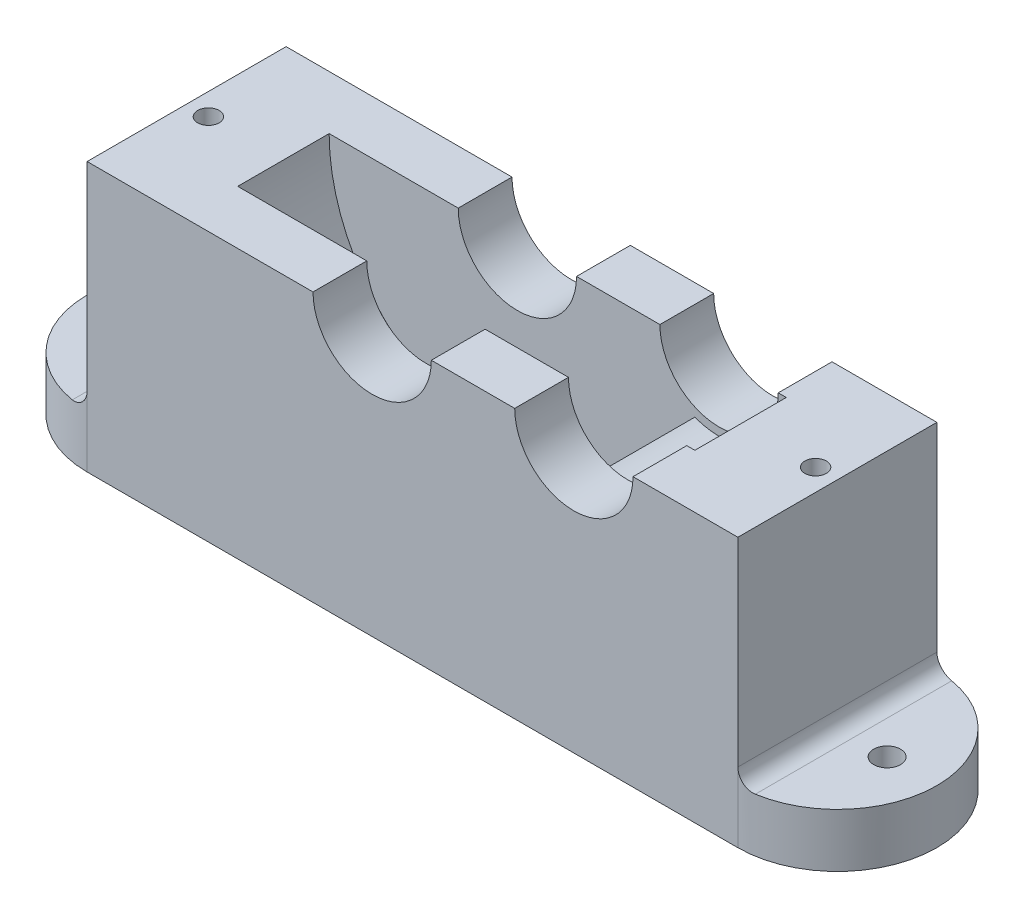
ISO-10303-21;
HEADER;
FILE_DESCRIPTION(('STEP AP214'),'2;1');
FILE_NAME('part.step','',(''),(''),'','','');
FILE_SCHEMA(('AUTOMOTIVE_DESIGN { 1 0 10303 214 1 1 1 1 }'));
ENDSEC;
DATA;
#1=APPLICATION_CONTEXT('core data for automotive mechanical design processes');
#2=APPLICATION_PROTOCOL_DEFINITION('international standard','automotive_design',2000,#1);
#3=PRODUCT_CONTEXT('',#1,'mechanical');
#4=PRODUCT('Part','Part','',(#3));
#5=PRODUCT_RELATED_PRODUCT_CATEGORY('part','',(#4));
#6=PRODUCT_DEFINITION_FORMATION('','',#4);
#7=PRODUCT_DEFINITION_CONTEXT('part definition',#1,'design');
#8=PRODUCT_DEFINITION('design','',#6,#7);
#9=PRODUCT_DEFINITION_SHAPE('','',#8);
#10=(LENGTH_UNIT() NAMED_UNIT(*) SI_UNIT(.MILLI.,.METRE.));
#11=(NAMED_UNIT(*) PLANE_ANGLE_UNIT() SI_UNIT($,.RADIAN.));
#12=(NAMED_UNIT(*) SI_UNIT($,.STERADIAN.) SOLID_ANGLE_UNIT());
#13=UNCERTAINTY_MEASURE_WITH_UNIT(LENGTH_MEASURE(1.E-05),#10,'distance_accuracy_value','');
#14=(GEOMETRIC_REPRESENTATION_CONTEXT(3) GLOBAL_UNCERTAINTY_ASSIGNED_CONTEXT((#13)) GLOBAL_UNIT_ASSIGNED_CONTEXT((#10,
#11,#12)) REPRESENTATION_CONTEXT('',''));
#15=CARTESIAN_POINT('',(0.,0.,0.));
#16=DIRECTION('',(0.,0.,1.));
#17=DIRECTION('',(1.,0.,0.));
#18=AXIS2_PLACEMENT_3D('',#15,#16,#17);
#19=CARTESIAN_POINT('',(-71.75,-89.2173431022552,0.));
#20=DIRECTION('',(-1.,0.,0.));
#21=DIRECTION('',(0.,0.,1.));
#22=AXIS2_PLACEMENT_3D('',#19,#20,#21);
#23=PLANE('',#22);
#24=DIRECTION('',(0.,1.,0.));
#25=VECTOR('',#24,1.);
#26=CARTESIAN_POINT('',(-71.75,-89.2173431022552,-10.));
#27=LINE('',#26,#25);
#28=CARTESIAN_POINT('',(-71.75,-37.,-10.));
#29=VERTEX_POINT('',#28);
#30=CARTESIAN_POINT('',(-71.75,0.,-10.));
#31=VERTEX_POINT('',#30);
#32=EDGE_CURVE('E213',#29,#31,#27,.T.);
#33=ORIENTED_EDGE('',*,*,#32,.F.);
#34=DIRECTION('',(0.,0.,1.));
#35=VECTOR('',#34,1.);
#36=CARTESIAN_POINT('',(-71.75,-37.,0.));
#37=LINE('',#36,#35);
#38=CARTESIAN_POINT('',(-71.75,-37.,27.));
#39=VERTEX_POINT('',#38);
#40=EDGE_CURVE('E263',#29,#39,#37,.T.);
#41=ORIENTED_EDGE('',*,*,#40,.T.);
#42=DIRECTION('',(0.,1.,0.));
#43=VECTOR('',#42,1.);
#44=CARTESIAN_POINT('',(-71.75,-89.2173431022552,27.));
#45=LINE('',#44,#43);
#46=CARTESIAN_POINT('',(-71.75,0.,27.));
#47=VERTEX_POINT('',#46);
#48=EDGE_CURVE('E373',#39,#47,#45,.T.);
#49=ORIENTED_EDGE('',*,*,#48,.T.);
#50=DIRECTION('',(0.,0.,1.));
#51=VECTOR('',#50,1.);
#52=CARTESIAN_POINT('',(-71.75,0.,-10.));
#53=LINE('',#52,#51);
#54=EDGE_CURVE('E308',#31,#47,#53,.T.);
#55=ORIENTED_EDGE('',*,*,#54,.F.);
#56=EDGE_LOOP('',(#33,#41,#49,#55));
#57=FACE_BOUND('',#56,.T.);
#58=ADVANCED_FACE('F43',(#57),#23,.T.);
#59=CARTESIAN_POINT('',(49.25,-89.2173431022552,0.));
#60=DIRECTION('',(-1.,0.,0.));
#61=DIRECTION('',(0.,0.,1.));
#62=AXIS2_PLACEMENT_3D('',#59,#60,#61);
#63=PLANE('',#62);
#64=DIRECTION('',(0.,1.,0.));
#65=VECTOR('',#64,1.);
#66=CARTESIAN_POINT('',(49.25,-89.2173431022552,27.));
#67=LINE('',#66,#65);
#68=CARTESIAN_POINT('',(49.25,-37.,27.));
#69=VERTEX_POINT('',#68);
#70=CARTESIAN_POINT('',(49.25,0.,27.));
#71=VERTEX_POINT('',#70);
#72=EDGE_CURVE('E207',#69,#71,#67,.T.);
#73=ORIENTED_EDGE('',*,*,#72,.F.);
#74=DIRECTION('',(0.,0.,1.));
#75=VECTOR('',#74,1.);
#76=CARTESIAN_POINT('',(49.25,-37.,-9.99999999999998));
#77=LINE('',#76,#75);
#78=CARTESIAN_POINT('',(49.25,-37.,-9.99999999999999));
#79=VERTEX_POINT('',#78);
#80=EDGE_CURVE('E261',#69,#79,#77,.F.);
#81=ORIENTED_EDGE('',*,*,#80,.T.);
#82=DIRECTION('',(0.,1.,0.));
#83=VECTOR('',#82,1.);
#84=CARTESIAN_POINT('',(49.25,-89.2173431022552,-9.99999999999999));
#85=LINE('',#84,#83);
#86=CARTESIAN_POINT('',(49.25,0.,-10.));
#87=VERTEX_POINT('',#86);
#88=EDGE_CURVE('E205',#79,#87,#85,.T.);
#89=ORIENTED_EDGE('',*,*,#88,.T.);
#90=DIRECTION('',(0.,0.,-1.));
#91=VECTOR('',#90,1.);
#92=CARTESIAN_POINT('',(49.25,0.,-10.));
#93=LINE('',#92,#91);
#94=EDGE_CURVE('E314',#71,#87,#93,.T.);
#95=ORIENTED_EDGE('',*,*,#94,.F.);
#96=EDGE_LOOP('',(#73,#81,#89,#95));
#97=FACE_BOUND('',#96,.T.);
#98=ADVANCED_FACE('F311',(#97),#63,.F.);
#99=CARTESIAN_POINT('',(45.1999443206437,-7.,8.5));
#100=DIRECTION('',(0.,-1.,0.));
#101=DIRECTION('',(0.,0.,-1.));
#102=AXIS2_PLACEMENT_3D('',#99,#100,#101);
#103=PLANE('',#102);
#104=CARTESIAN_POINT('',(45.1999443206437,-7.,8.5));
#105=DIRECTION('',(0.,-1.,0.));
#106=DIRECTION('',(0.,0.,-1.));
#107=AXIS2_PLACEMENT_3D('',#104,#105,#106);
#108=CIRCLE('',#107,2.);
#109=CARTESIAN_POINT('',(45.1999443206437,-7.,6.5));
#110=VERTEX_POINT('',#109);
#111=EDGE_CURVE('E210',#110,#110,#108,.T.);
#112=ORIENTED_EDGE('',*,*,#111,.F.);
#113=EDGE_LOOP('',(#112));
#114=FACE_BOUND('',#113,.T.);
#115=ADVANCED_FACE('F387',(#114),#103,.F.);
#116=CARTESIAN_POINT('',(45.1999443206437,-7.,8.5));
#117=DIRECTION('',(0.,1.,0.));
#118=DIRECTION('',(0.,0.,1.));
#119=AXIS2_PLACEMENT_3D('',#116,#117,#118);
#120=CYLINDRICAL_SURFACE('',#119,2.);
#121=ORIENTED_EDGE('',*,*,#111,.T.);
#122=EDGE_LOOP('',(#121));
#123=FACE_BOUND('',#122,.T.);
#124=CARTESIAN_POINT('',(45.1999443206437,0.,8.5));
#125=DIRECTION('',(0.,1.,0.));
#126=DIRECTION('',(0.,0.,1.));
#127=AXIS2_PLACEMENT_3D('',#124,#125,#126);
#128=CIRCLE('',#127,2.);
#129=CARTESIAN_POINT('',(45.1999443206437,0.,10.5));
#130=VERTEX_POINT('',#129);
#131=EDGE_CURVE('E257',#130,#130,#128,.T.);
#132=ORIENTED_EDGE('',*,*,#131,.T.);
#133=EDGE_LOOP('',(#132));
#134=FACE_BOUND('',#133,.T.);
#135=ADVANCED_FACE('F518',(#123,#134),#120,.F.);
#136=CARTESIAN_POINT('',(0.,0.,0.));
#137=DIRECTION('',(0.,1.,0.));
#138=DIRECTION('',(0.,0.,1.));
#139=AXIS2_PLACEMENT_3D('',#136,#137,#138);
#140=PLANE('',#139);
#141=ORIENTED_EDGE('',*,*,#131,.F.);
#142=EDGE_LOOP('',(#141));
#143=FACE_BOUND('',#142,.T.);
#144=DIRECTION('',(0.,0.,-1.));
#145=VECTOR('',#144,1.);
#146=CARTESIAN_POINT('',(29.75,0.,27.));
#147=LINE('',#146,#145);
#148=CARTESIAN_POINT('',(29.75,0.,17.));
#149=VERTEX_POINT('',#148);
#150=CARTESIAN_POINT('',(29.75,0.,27.));
#151=VERTEX_POINT('',#150);
#152=EDGE_CURVE('E323',#149,#151,#147,.F.);
#153=ORIENTED_EDGE('',*,*,#152,.T.);
#154=DIRECTION('',(1.,0.,0.));
#155=VECTOR('',#154,1.);
#156=CARTESIAN_POINT('',(-71.75,0.,27.));
#157=LINE('',#156,#155);
#158=EDGE_CURVE('E318',#151,#71,#157,.T.);
#159=ORIENTED_EDGE('',*,*,#158,.T.);
#160=ORIENTED_EDGE('',*,*,#94,.T.);
#161=DIRECTION('',(-1.,0.,0.));
#162=VECTOR('',#161,1.);
#163=CARTESIAN_POINT('',(-71.75,0.,-10.));
#164=LINE('',#163,#162);
#165=CARTESIAN_POINT('',(29.75,0.,-10.));
#166=VERTEX_POINT('',#165);
#167=EDGE_CURVE('E258',#87,#166,#164,.T.);
#168=ORIENTED_EDGE('',*,*,#167,.T.);
#169=DIRECTION('',(0.,0.,-1.));
#170=VECTOR('',#169,1.);
#171=CARTESIAN_POINT('',(29.75,0.,27.));
#172=LINE('',#171,#170);
#173=CARTESIAN_POINT('',(29.75,0.,0.));
#174=VERTEX_POINT('',#173);
#175=EDGE_CURVE('E348',#166,#174,#172,.F.);
#176=ORIENTED_EDGE('',*,*,#175,.T.);
#177=DIRECTION('',(1.,0.,0.));
#178=VECTOR('',#177,1.);
#179=CARTESIAN_POINT('',(0.,0.,0.));
#180=LINE('',#179,#178);
#181=CARTESIAN_POINT('',(31.25,0.,0.));
#182=VERTEX_POINT('',#181);
#183=EDGE_CURVE('E346',#174,#182,#180,.T.);
#184=ORIENTED_EDGE('',*,*,#183,.T.);
#185=DIRECTION('',(0.,0.,-1.));
#186=VECTOR('',#185,1.);
#187=CARTESIAN_POINT('',(31.25,0.,27.));
#188=LINE('',#187,#186);
#189=CARTESIAN_POINT('',(31.25,0.,17.));
#190=VERTEX_POINT('',#189);
#191=EDGE_CURVE('E350',#190,#182,#188,.T.);
#192=ORIENTED_EDGE('',*,*,#191,.F.);
#193=DIRECTION('',(-1.,0.,0.));
#194=VECTOR('',#193,1.);
#195=CARTESIAN_POINT('',(0.,0.,17.));
#196=LINE('',#195,#194);
#197=EDGE_CURVE('E353',#190,#149,#196,.T.);
#198=ORIENTED_EDGE('',*,*,#197,.T.);
#199=EDGE_LOOP('',(#153,#159,#160,#168,#176,#184,#192,#198));
#200=FACE_BOUND('',#199,.T.);
#201=ADVANCED_FACE('F321',(#143,#200),#140,.T.);
#202=CARTESIAN_POINT('',(0.,0.,0.));
#203=DIRECTION('',(0.,0.,-1.));
#204=DIRECTION('',(-1.,0.,0.));
#205=AXIS2_PLACEMENT_3D('',#202,#203,#204);
#206=PLANE('',#205);
#207=CARTESIAN_POINT('',(-53.75,0.,0.));
#208=VERTEX_POINT('',#207);
#209=CARTESIAN_POINT('',(-29.75,0.,0.));
#210=VERTEX_POINT('',#209);
#211=EDGE_CURVE('E345',#208,#210,#180,.T.);
#212=ORIENTED_EDGE('',*,*,#211,.F.);
#213=CARTESIAN_POINT('',(-18.75,0.,0.));
#214=DIRECTION('',(0.,0.,1.));
#215=DIRECTION('',(1.,0.,0.));
#216=AXIS2_PLACEMENT_3D('',#213,#214,#215);
#217=CIRCLE('',#216,35.);
#218=CARTESIAN_POINT('',(14.25,-11.6619037896906,0.));
#219=VERTEX_POINT('',#218);
#220=EDGE_CURVE('E241',#208,#219,#217,.T.);
#221=ORIENTED_EDGE('',*,*,#220,.T.);
#222=CARTESIAN_POINT('',(18.75,0.,0.));
#223=DIRECTION('',(0.,0.,1.));
#224=DIRECTION('',(1.,0.,0.));
#225=AXIS2_PLACEMENT_3D('',#222,#223,#224);
#226=CIRCLE('',#225,12.5);
#227=EDGE_CURVE('E236',#219,#182,#226,.T.);
#228=ORIENTED_EDGE('',*,*,#227,.T.);
#229=ORIENTED_EDGE('',*,*,#183,.F.);
#230=CARTESIAN_POINT('',(18.75,0.,0.));
#231=DIRECTION('',(0.,0.,-1.));
#232=DIRECTION('',(-1.,0.,0.));
#233=AXIS2_PLACEMENT_3D('',#230,#231,#232);
#234=CIRCLE('',#233,11.);
#235=CARTESIAN_POINT('',(7.75,0.,0.));
#236=VERTEX_POINT('',#235);
#237=EDGE_CURVE('E233',#174,#236,#234,.T.);
#238=ORIENTED_EDGE('',*,*,#237,.T.);
#239=CARTESIAN_POINT('',(-7.75,0.,0.));
#240=VERTEX_POINT('',#239);
#241=EDGE_CURVE('E342',#240,#236,#180,.T.);
#242=ORIENTED_EDGE('',*,*,#241,.F.);
#243=CARTESIAN_POINT('',(-18.75,0.,0.));
#244=DIRECTION('',(0.,0.,-1.));
#245=DIRECTION('',(-1.,0.,0.));
#246=AXIS2_PLACEMENT_3D('',#243,#244,#245);
#247=CIRCLE('',#246,11.);
#248=EDGE_CURVE('E229',#240,#210,#247,.T.);
#249=ORIENTED_EDGE('',*,*,#248,.T.);
#250=EDGE_LOOP('',(#212,#221,#228,#229,#238,#242,#249));
#251=FACE_BOUND('',#250,.T.);
#252=ADVANCED_FACE('F410',(#251),#206,.F.);
#253=CARTESIAN_POINT('',(0.,0.,17.));
#254=DIRECTION('',(0.,0.,1.));
#255=DIRECTION('',(1.,0.,0.));
#256=AXIS2_PLACEMENT_3D('',#253,#254,#255);
#257=PLANE('',#256);
#258=ORIENTED_EDGE('',*,*,#197,.F.);
#259=CARTESIAN_POINT('',(18.75,0.,17.));
#260=DIRECTION('',(0.,0.,1.));
#261=DIRECTION('',(1.,0.,0.));
#262=AXIS2_PLACEMENT_3D('',#259,#260,#261);
#263=CIRCLE('',#262,12.5);
#264=CARTESIAN_POINT('',(14.25,-11.6619037896906,17.));
#265=VERTEX_POINT('',#264);
#266=EDGE_CURVE('E237',#265,#190,#263,.T.);
#267=ORIENTED_EDGE('',*,*,#266,.F.);
#268=CARTESIAN_POINT('',(-18.75,0.,17.));
#269=DIRECTION('',(0.,0.,1.));
#270=DIRECTION('',(1.,0.,0.));
#271=AXIS2_PLACEMENT_3D('',#268,#269,#270);
#272=CIRCLE('',#271,35.);
#273=CARTESIAN_POINT('',(-53.75,0.,17.));
#274=VERTEX_POINT('',#273);
#275=EDGE_CURVE('E240',#274,#265,#272,.T.);
#276=ORIENTED_EDGE('',*,*,#275,.F.);
#277=CARTESIAN_POINT('',(-29.75,0.,17.));
#278=VERTEX_POINT('',#277);
#279=EDGE_CURVE('E356',#278,#274,#196,.T.);
#280=ORIENTED_EDGE('',*,*,#279,.F.);
#281=CARTESIAN_POINT('',(-18.75,0.,17.));
#282=DIRECTION('',(0.,0.,1.));
#283=DIRECTION('',(1.,0.,0.));
#284=AXIS2_PLACEMENT_3D('',#281,#282,#283);
#285=CIRCLE('',#284,11.);
#286=CARTESIAN_POINT('',(-7.75,0.,17.));
#287=VERTEX_POINT('',#286);
#288=EDGE_CURVE('E220',#278,#287,#285,.T.);
#289=ORIENTED_EDGE('',*,*,#288,.T.);
#290=CARTESIAN_POINT('',(7.75,0.,17.));
#291=VERTEX_POINT('',#290);
#292=EDGE_CURVE('E355',#291,#287,#196,.T.);
#293=ORIENTED_EDGE('',*,*,#292,.F.);
#294=CARTESIAN_POINT('',(18.75,0.,17.));
#295=DIRECTION('',(0.,0.,1.));
#296=DIRECTION('',(1.,0.,0.));
#297=AXIS2_PLACEMENT_3D('',#294,#295,#296);
#298=CIRCLE('',#297,11.);
#299=EDGE_CURVE('E232',#291,#149,#298,.T.);
#300=ORIENTED_EDGE('',*,*,#299,.T.);
#301=EDGE_LOOP('',(#258,#267,#276,#280,#289,#293,#300));
#302=FACE_BOUND('',#301,.T.);
#303=ADVANCED_FACE('F413',(#302),#257,.F.);
#304=CARTESIAN_POINT('',(18.75,0.,27.));
#305=DIRECTION('',(0.,0.,-1.));
#306=DIRECTION('',(-1.,0.,0.));
#307=AXIS2_PLACEMENT_3D('',#304,#305,#306);
#308=CYLINDRICAL_SURFACE('',#307,12.5);
#309=ORIENTED_EDGE('',*,*,#266,.T.);
#310=ORIENTED_EDGE('',*,*,#191,.T.);
#311=ORIENTED_EDGE('',*,*,#227,.F.);
#312=DIRECTION('',(0.,0.,-1.));
#313=VECTOR('',#312,1.);
#314=CARTESIAN_POINT('',(14.25,-11.6619037896906,17.));
#315=LINE('',#314,#313);
#316=EDGE_CURVE('E242',#265,#219,#315,.T.);
#317=ORIENTED_EDGE('',*,*,#316,.F.);
#318=EDGE_LOOP('',(#309,#310,#311,#317));
#319=FACE_BOUND('',#318,.T.);
#320=ADVANCED_FACE('F415',(#319),#308,.F.);
#321=CARTESIAN_POINT('',(-18.75,0.,27.));
#322=DIRECTION('',(0.,0.,-1.));
#323=DIRECTION('',(-1.,0.,0.));
#324=AXIS2_PLACEMENT_3D('',#321,#322,#323);
#325=CYLINDRICAL_SURFACE('',#324,35.);
#326=ORIENTED_EDGE('',*,*,#220,.F.);
#327=DIRECTION('',(0.,0.,-1.));
#328=VECTOR('',#327,1.);
#329=CARTESIAN_POINT('',(-53.75,0.,27.));
#330=LINE('',#329,#328);
#331=EDGE_CURVE('E360',#208,#274,#330,.F.);
#332=ORIENTED_EDGE('',*,*,#331,.T.);
#333=ORIENTED_EDGE('',*,*,#275,.T.);
#334=ORIENTED_EDGE('',*,*,#316,.T.);
#335=EDGE_LOOP('',(#326,#332,#333,#334));
#336=FACE_BOUND('',#335,.T.);
#337=ADVANCED_FACE('F406',(#336),#325,.F.);
#338=CARTESIAN_POINT('',(-18.75,0.,27.));
#339=DIRECTION('',(0.,0.,-1.));
#340=DIRECTION('',(-1.,0.,0.));
#341=AXIS2_PLACEMENT_3D('',#338,#339,#340);
#342=CYLINDRICAL_SURFACE('',#341,11.);
#343=DIRECTION('',(0.,0.,-1.));
#344=VECTOR('',#343,1.);
#345=CARTESIAN_POINT('',(-7.75,0.,27.));
#346=LINE('',#345,#344);
#347=CARTESIAN_POINT('',(-7.75,0.,27.));
#348=VERTEX_POINT('',#347);
#349=EDGE_CURVE('E367',#287,#348,#346,.F.);
#350=ORIENTED_EDGE('',*,*,#349,.F.);
#351=ORIENTED_EDGE('',*,*,#288,.F.);
#352=DIRECTION('',(0.,0.,-1.));
#353=VECTOR('',#352,1.);
#354=CARTESIAN_POINT('',(-29.75,0.,27.));
#355=LINE('',#354,#353);
#356=CARTESIAN_POINT('',(-29.75,0.,27.));
#357=VERTEX_POINT('',#356);
#358=EDGE_CURVE('E363',#357,#278,#355,.T.);
#359=ORIENTED_EDGE('',*,*,#358,.F.);
#360=CARTESIAN_POINT('',(-18.75,0.,27.));
#361=DIRECTION('',(0.,0.,-1.));
#362=DIRECTION('',(-1.,0.,0.));
#363=AXIS2_PLACEMENT_3D('',#360,#361,#362);
#364=CIRCLE('',#363,11.);
#365=EDGE_CURVE('E224',#348,#357,#364,.T.);
#366=ORIENTED_EDGE('',*,*,#365,.F.);
#367=EDGE_LOOP('',(#350,#351,#359,#366));
#368=FACE_BOUND('',#367,.T.);
#369=ADVANCED_FACE('F401',(#368),#342,.F.);
#370=CARTESIAN_POINT('',(18.75,0.,27.));
#371=DIRECTION('',(0.,0.,-1.));
#372=DIRECTION('',(-1.,0.,0.));
#373=AXIS2_PLACEMENT_3D('',#370,#371,#372);
#374=CYLINDRICAL_SURFACE('',#373,11.);
#375=ORIENTED_EDGE('',*,*,#152,.F.);
#376=ORIENTED_EDGE('',*,*,#299,.F.);
#377=DIRECTION('',(0.,0.,-1.));
#378=VECTOR('',#377,1.);
#379=CARTESIAN_POINT('',(7.75,0.,27.));
#380=LINE('',#379,#378);
#381=CARTESIAN_POINT('',(7.75000000000001,0.,27.));
#382=VERTEX_POINT('',#381);
#383=EDGE_CURVE('E365',#382,#291,#380,.T.);
#384=ORIENTED_EDGE('',*,*,#383,.F.);
#385=CARTESIAN_POINT('',(18.75,0.,27.));
#386=DIRECTION('',(0.,0.,-1.));
#387=DIRECTION('',(-1.,0.,0.));
#388=AXIS2_PLACEMENT_3D('',#385,#386,#387);
#389=CIRCLE('',#388,11.);
#390=EDGE_CURVE('E217',#151,#382,#389,.T.);
#391=ORIENTED_EDGE('',*,*,#390,.F.);
#392=EDGE_LOOP('',(#375,#376,#384,#391));
#393=FACE_BOUND('',#392,.T.);
#394=ADVANCED_FACE('F397',(#393),#374,.F.);
#395=DIRECTION('',(0.,0.,-1.));
#396=VECTOR('',#395,1.);
#397=CARTESIAN_POINT('',(-7.75,0.,27.));
#398=LINE('',#397,#396);
#399=CARTESIAN_POINT('',(-7.75000000000001,0.,-10.));
#400=VERTEX_POINT('',#399);
#401=EDGE_CURVE('E344',#400,#240,#398,.F.);
#402=ORIENTED_EDGE('',*,*,#401,.F.);
#403=CARTESIAN_POINT('',(-18.75,0.,-10.));
#404=DIRECTION('',(0.,0.,-1.));
#405=DIRECTION('',(-1.,0.,0.));
#406=AXIS2_PLACEMENT_3D('',#403,#404,#405);
#407=CIRCLE('',#406,11.);
#408=CARTESIAN_POINT('',(-29.75,0.,-10.));
#409=VERTEX_POINT('',#408);
#410=EDGE_CURVE('E216',#400,#409,#407,.T.);
#411=ORIENTED_EDGE('',*,*,#410,.T.);
#412=DIRECTION('',(0.,0.,-1.));
#413=VECTOR('',#412,1.);
#414=CARTESIAN_POINT('',(-29.75,0.,27.));
#415=LINE('',#414,#413);
#416=EDGE_CURVE('E358',#210,#409,#415,.T.);
#417=ORIENTED_EDGE('',*,*,#416,.F.);
#418=ORIENTED_EDGE('',*,*,#248,.F.);
#419=EDGE_LOOP('',(#402,#411,#417,#418));
#420=FACE_BOUND('',#419,.T.);
#421=ADVANCED_FACE('F400',(#420),#342,.F.);
#422=ORIENTED_EDGE('',*,*,#175,.F.);
#423=CARTESIAN_POINT('',(18.75,0.,-10.));
#424=DIRECTION('',(0.,0.,-1.));
#425=DIRECTION('',(-1.,0.,0.));
#426=AXIS2_PLACEMENT_3D('',#423,#424,#425);
#427=CIRCLE('',#426,11.);
#428=CARTESIAN_POINT('',(7.75,0.,-10.));
#429=VERTEX_POINT('',#428);
#430=EDGE_CURVE('E221',#166,#429,#427,.T.);
#431=ORIENTED_EDGE('',*,*,#430,.T.);
#432=DIRECTION('',(0.,0.,-1.));
#433=VECTOR('',#432,1.);
#434=CARTESIAN_POINT('',(7.75,0.,27.));
#435=LINE('',#434,#433);
#436=EDGE_CURVE('E340',#236,#429,#435,.T.);
#437=ORIENTED_EDGE('',*,*,#436,.F.);
#438=ORIENTED_EDGE('',*,*,#237,.F.);
#439=EDGE_LOOP('',(#422,#431,#437,#438));
#440=FACE_BOUND('',#439,.T.);
#441=ADVANCED_FACE('F403',(#440),#374,.F.);
#442=CARTESIAN_POINT('',(0.,0.,27.));
#443=DIRECTION('',(0.,0.,1.));
#444=DIRECTION('',(1.,0.,0.));
#445=AXIS2_PLACEMENT_3D('',#442,#443,#444);
#446=PLANE('',#445);
#447=CARTESIAN_POINT('',(49.25,-50.,27.));
#448=VERTEX_POINT('',#447);
#449=EDGE_CURVE('E73',#448,#69,#67,.T.);
#450=ORIENTED_EDGE('',*,*,#449,.T.);
#451=ORIENTED_EDGE('',*,*,#72,.T.);
#452=ORIENTED_EDGE('',*,*,#158,.F.);
#453=ORIENTED_EDGE('',*,*,#390,.T.);
#454=EDGE_CURVE('E324',#348,#382,#157,.T.);
#455=ORIENTED_EDGE('',*,*,#454,.F.);
#456=ORIENTED_EDGE('',*,*,#365,.T.);
#457=EDGE_CURVE('E326',#47,#357,#157,.T.);
#458=ORIENTED_EDGE('',*,*,#457,.F.);
#459=ORIENTED_EDGE('',*,*,#48,.F.);
#460=CARTESIAN_POINT('',(-71.75,-50.,27.));
#461=VERTEX_POINT('',#460);
#462=EDGE_CURVE('E89',#461,#39,#45,.T.);
#463=ORIENTED_EDGE('',*,*,#462,.F.);
#464=DIRECTION('',(-1.,0.,0.));
#465=VECTOR('',#464,1.);
#466=CARTESIAN_POINT('',(41.25,-50.,27.));
#467=LINE('',#466,#465);
#468=EDGE_CURVE('E200',#448,#461,#467,.T.);
#469=ORIENTED_EDGE('',*,*,#468,.F.);
#470=EDGE_LOOP('',(#450,#451,#452,#453,#455,#456,#458,#459,#463,#469));
#471=FACE_BOUND('',#470,.T.);
#472=ADVANCED_FACE('F317',(#471),#446,.T.);
#473=CARTESIAN_POINT('',(0.,0.,-10.));
#474=DIRECTION('',(0.,0.,-1.));
#475=DIRECTION('',(-1.,0.,0.));
#476=AXIS2_PLACEMENT_3D('',#473,#474,#475);
#477=PLANE('',#476);
#478=CARTESIAN_POINT('',(-71.75,-50.,-10.));
#479=VERTEX_POINT('',#478);
#480=EDGE_CURVE('E64',#479,#29,#27,.T.);
#481=ORIENTED_EDGE('',*,*,#480,.T.);
#482=ORIENTED_EDGE('',*,*,#32,.T.);
#483=EDGE_CURVE('E333',#409,#31,#164,.T.);
#484=ORIENTED_EDGE('',*,*,#483,.F.);
#485=ORIENTED_EDGE('',*,*,#410,.F.);
#486=EDGE_CURVE('E335',#429,#400,#164,.T.);
#487=ORIENTED_EDGE('',*,*,#486,.F.);
#488=ORIENTED_EDGE('',*,*,#430,.F.);
#489=ORIENTED_EDGE('',*,*,#167,.F.);
#490=ORIENTED_EDGE('',*,*,#88,.F.);
#491=CARTESIAN_POINT('',(49.25,-50.,-9.99999999999998));
#492=VERTEX_POINT('',#491);
#493=EDGE_CURVE('E189',#492,#79,#85,.T.);
#494=ORIENTED_EDGE('',*,*,#493,.F.);
#495=DIRECTION('',(-1.,0.,0.));
#496=VECTOR('',#495,1.);
#497=CARTESIAN_POINT('',(41.25,-50.,-10.));
#498=LINE('',#497,#496);
#499=EDGE_CURVE('E198',#492,#479,#498,.T.);
#500=ORIENTED_EDGE('',*,*,#499,.T.);
#501=EDGE_LOOP('',(#481,#482,#484,#485,#487,#488,#489,#490,#494,#500));
#502=FACE_BOUND('',#501,.T.);
#503=ADVANCED_FACE('F203',(#502),#477,.T.);
#504=CARTESIAN_POINT('',(41.25,-50.,143.29703349613));
#505=DIRECTION('',(0.,-1.,0.));
#506=DIRECTION('',(0.,0.,-1.));
#507=AXIS2_PLACEMENT_3D('',#504,#505,#506);
#508=PLANE('',#507);
#509=CARTESIAN_POINT('',(-81.,-50.,8.49999999999999));
#510=DIRECTION('',(0.,1.,0.));
#511=DIRECTION('',(0.,0.,1.));
#512=AXIS2_PLACEMENT_3D('',#509,#510,#511);
#513=CIRCLE('',#512,2.50000000000001);
#514=CARTESIAN_POINT('',(-81.,-50.,11.));
#515=VERTEX_POINT('',#514);
#516=EDGE_CURVE('E460',#515,#515,#513,.T.);
#517=ORIENTED_EDGE('',*,*,#516,.T.);
#518=EDGE_LOOP('',(#517));
#519=FACE_BOUND('',#518,.T.);
#520=CARTESIAN_POINT('',(58.5,-50.,8.49999999999999));
#521=DIRECTION('',(0.,1.,0.));
#522=DIRECTION('',(0.,0.,1.));
#523=AXIS2_PLACEMENT_3D('',#520,#521,#522);
#524=CIRCLE('',#523,2.5);
#525=CARTESIAN_POINT('',(58.5,-50.,11.));
#526=VERTEX_POINT('',#525);
#527=EDGE_CURVE('E467',#526,#526,#524,.T.);
#528=ORIENTED_EDGE('',*,*,#527,.T.);
#529=EDGE_LOOP('',(#528));
#530=FACE_BOUND('',#529,.T.);
#531=ORIENTED_EDGE('',*,*,#468,.T.);
#532=CARTESIAN_POINT('',(-71.75,-50.,8.5));
#533=DIRECTION('',(0.,-1.,0.));
#534=DIRECTION('',(0.,0.,-1.));
#535=AXIS2_PLACEMENT_3D('',#532,#533,#534);
#536=CIRCLE('',#535,18.5);
#537=EDGE_CURVE('E195',#461,#479,#536,.T.);
#538=ORIENTED_EDGE('',*,*,#537,.T.);
#539=ORIENTED_EDGE('',*,*,#499,.F.);
#540=CARTESIAN_POINT('',(49.25,-50.,8.5));
#541=DIRECTION('',(0.,-1.,0.));
#542=DIRECTION('',(0.,0.,1.));
#543=AXIS2_PLACEMENT_3D('',#540,#541,#542);
#544=CIRCLE('',#543,18.5);
#545=EDGE_CURVE('E185',#492,#448,#544,.T.);
#546=ORIENTED_EDGE('',*,*,#545,.T.);
#547=EDGE_LOOP('',(#531,#538,#539,#546));
#548=FACE_BOUND('',#547,.T.);
#549=ADVANCED_FACE('F199',(#519,#530,#548),#508,.T.);
#550=ORIENTED_EDGE('',*,*,#401,.T.);
#551=ORIENTED_EDGE('',*,*,#241,.T.);
#552=ORIENTED_EDGE('',*,*,#436,.T.);
#553=ORIENTED_EDGE('',*,*,#486,.T.);
#554=EDGE_LOOP('',(#550,#551,#552,#553));
#555=FACE_BOUND('',#554,.T.);
#556=ADVANCED_FACE('F395',(#555),#140,.T.);
#557=ORIENTED_EDGE('',*,*,#349,.T.);
#558=ORIENTED_EDGE('',*,*,#454,.T.);
#559=ORIENTED_EDGE('',*,*,#383,.T.);
#560=ORIENTED_EDGE('',*,*,#292,.T.);
#561=EDGE_LOOP('',(#557,#558,#559,#560));
#562=FACE_BOUND('',#561,.T.);
#563=ADVANCED_FACE('F294',(#562),#140,.T.);
#564=CARTESIAN_POINT('',(-67.6999443206437,0.,8.5));
#565=DIRECTION('',(0.,1.,0.));
#566=DIRECTION('',(0.,0.,1.));
#567=AXIS2_PLACEMENT_3D('',#564,#565,#566);
#568=CIRCLE('',#567,2.);
#569=CARTESIAN_POINT('',(-67.6999443206437,0.,10.5));
#570=VERTEX_POINT('',#569);
#571=EDGE_CURVE('E254',#570,#570,#568,.F.);
#572=ORIENTED_EDGE('',*,*,#571,.T.);
#573=EDGE_LOOP('',(#572));
#574=FACE_BOUND('',#573,.T.);
#575=ORIENTED_EDGE('',*,*,#358,.T.);
#576=ORIENTED_EDGE('',*,*,#279,.T.);
#577=ORIENTED_EDGE('',*,*,#331,.F.);
#578=ORIENTED_EDGE('',*,*,#211,.T.);
#579=ORIENTED_EDGE('',*,*,#416,.T.);
#580=ORIENTED_EDGE('',*,*,#483,.T.);
#581=ORIENTED_EDGE('',*,*,#54,.T.);
#582=ORIENTED_EDGE('',*,*,#457,.T.);
#583=EDGE_LOOP('',(#575,#576,#577,#578,#579,#580,#581,#582));
#584=FACE_BOUND('',#583,.T.);
#585=ADVANCED_FACE('F379',(#574,#584),#140,.T.);
#586=CARTESIAN_POINT('',(-67.6999443206437,-7.,8.5));
#587=DIRECTION('',(0.,1.,0.));
#588=DIRECTION('',(0.,0.,1.));
#589=AXIS2_PLACEMENT_3D('',#586,#587,#588);
#590=PLANE('',#589);
#591=CARTESIAN_POINT('',(-67.6999443206437,-7.,8.5));
#592=DIRECTION('',(0.,1.,0.));
#593=DIRECTION('',(0.,0.,1.));
#594=AXIS2_PLACEMENT_3D('',#591,#592,#593);
#595=CIRCLE('',#594,2.);
#596=CARTESIAN_POINT('',(-67.6999443206437,-7.,10.5));
#597=VERTEX_POINT('',#596);
#598=EDGE_CURVE('E369',#597,#597,#595,.T.);
#599=ORIENTED_EDGE('',*,*,#598,.T.);
#600=EDGE_LOOP('',(#599));
#601=FACE_BOUND('',#600,.T.);
#602=ADVANCED_FACE('F390',(#601),#590,.T.);
#603=CARTESIAN_POINT('',(-67.6999443206437,-7.,8.5));
#604=DIRECTION('',(0.,1.,0.));
#605=DIRECTION('',(0.,0.,1.));
#606=AXIS2_PLACEMENT_3D('',#603,#604,#605);
#607=CYLINDRICAL_SURFACE('',#606,2.);
#608=ORIENTED_EDGE('',*,*,#598,.F.);
#609=EDGE_LOOP('',(#608));
#610=FACE_BOUND('',#609,.T.);
#611=ORIENTED_EDGE('',*,*,#571,.F.);
#612=EDGE_LOOP('',(#611));
#613=FACE_BOUND('',#612,.T.);
#614=ADVANCED_FACE('F612',(#610,#613),#607,.F.);
#615=CARTESIAN_POINT('',(-71.75,-40.,8.5));
#616=DIRECTION('',(0.,-1.,0.));
#617=DIRECTION('',(0.,0.,-1.));
#618=AXIS2_PLACEMENT_3D('',#615,#616,#617);
#619=PLANE('',#618);
#620=CARTESIAN_POINT('',(58.5,-40.,8.49999999999999));
#621=DIRECTION('',(0.,1.,0.));
#622=DIRECTION('',(0.,0.,1.));
#623=AXIS2_PLACEMENT_3D('',#620,#621,#622);
#624=CIRCLE('',#623,2.5);
#625=CARTESIAN_POINT('',(58.5,-40.,11.));
#626=VERTEX_POINT('',#625);
#627=EDGE_CURVE('E470',#626,#626,#624,.T.);
#628=ORIENTED_EDGE('',*,*,#627,.F.);
#629=EDGE_LOOP('',(#628));
#630=FACE_BOUND('',#629,.T.);
#631=CARTESIAN_POINT('',(49.25,-40.,8.5));
#632=DIRECTION('',(0.,-1.,0.));
#633=DIRECTION('',(0.,0.,1.));
#634=AXIS2_PLACEMENT_3D('',#631,#632,#633);
#635=CIRCLE('',#634,18.5);
#636=CARTESIAN_POINT('',(52.25,-40.,-9.75513626352867));
#637=VERTEX_POINT('',#636);
#638=CARTESIAN_POINT('',(52.25,-40.,26.7551362635287));
#639=VERTEX_POINT('',#638);
#640=EDGE_CURVE('E303',#637,#639,#635,.T.);
#641=ORIENTED_EDGE('',*,*,#640,.F.);
#642=DIRECTION('',(0.,0.,1.));
#643=VECTOR('',#642,1.);
#644=CARTESIAN_POINT('',(52.25,-40.,27.));
#645=LINE('',#644,#643);
#646=EDGE_CURVE('E245',#637,#639,#645,.T.);
#647=ORIENTED_EDGE('',*,*,#646,.T.);
#648=EDGE_LOOP('',(#641,#647));
#649=FACE_BOUND('',#648,.T.);
#650=ADVANCED_FACE('F287',(#630,#649),#619,.F.);
#651=CARTESIAN_POINT('',(49.25,-40.,8.5));
#652=DIRECTION('',(0.,-1.,0.));
#653=DIRECTION('',(0.,0.,-1.));
#654=AXIS2_PLACEMENT_3D('',#651,#652,#653);
#655=CYLINDRICAL_SURFACE('',#654,18.5);
#656=ORIENTED_EDGE('',*,*,#545,.F.);
#657=ORIENTED_EDGE('',*,*,#493,.T.);
#658=CARTESIAN_POINT('',(49.25,-37.,-9.99999999999999));
#659=CARTESIAN_POINT('',(49.2499919259169,-37.0843579090775,-9.99999570405729));
#660=CARTESIAN_POINT('',(49.2535581004877,-37.1687119845627,-9.99999988788792));
#661=CARTESIAN_POINT('',(49.2677764591656,-37.336816999326,-9.99999396141046));
#662=CARTESIAN_POINT('',(49.278428311224,-37.420567966681,-9.99998385177215));
#663=CARTESIAN_POINT('',(49.3067454925824,-37.5868202766254,-9.99991811347028));
#664=CARTESIAN_POINT('',(49.3244058373097,-37.6693224641706,-9.99986251712795));
#665=CARTESIAN_POINT('',(49.3665967375793,-37.8325260351147,-9.99964447984134));
#666=CARTESIAN_POINT('',(49.3911272091187,-37.9132274405192,-9.99948204020343));
#667=CARTESIAN_POINT('',(49.4748264873334,-38.1518542579018,-9.99871937480303));
#668=CARTESIAN_POINT('',(49.5441143263606,-38.3063674960221,-9.99784389020119));
#669=CARTESIAN_POINT('',(49.7075899193612,-38.6014481209708,-9.99451938579513));
#670=CARTESIAN_POINT('',(49.8017733863951,-38.7420179030875,-9.99207063679777));
#671=CARTESIAN_POINT('',(50.0122490409167,-39.0051962971466,-9.98458882749732));
#672=CARTESIAN_POINT('',(50.1285166169239,-39.1278246370126,-9.97955863354692));
#673=CARTESIAN_POINT('',(50.3798554425258,-39.3517854335763,-9.96589361250435));
#674=CARTESIAN_POINT('',(50.5149282991264,-39.4531160684185,-9.95725847722561));
#675=CARTESIAN_POINT('',(50.7992271100568,-39.6312122765757,-9.93556643369226));
#676=CARTESIAN_POINT('',(50.9483878096944,-39.7080845390668,-9.92252925571328));
#677=CARTESIAN_POINT('',(51.256962205521,-39.835793297941,-9.89146782970473));
#678=CARTESIAN_POINT('',(51.4163717266826,-39.8866403214374,-9.87344560266049));
#679=CARTESIAN_POINT('',(51.6889073089808,-39.949243632678,-9.83886974697521));
#680=CARTESIAN_POINT('',(51.8005911180872,-39.9682938164683,-9.82367888050833));
#681=CARTESIAN_POINT('',(52.0248971052116,-39.9936717846419,-9.79106097646967));
#682=CARTESIAN_POINT('',(52.1375175916098,-40.0000189350183,-9.77363738594387));
#683=CARTESIAN_POINT('',(52.25,-40.,-9.75513626352867));
#684=B_SPLINE_CURVE_WITH_KNOTS('',3,(#658,#659,#660,#661,#662,#663,#664,#665,#666,#667,#668,
#669,#670,#671,#672,#673,#674,#675,#676,#677,#678,#679,#680,#681,#682,#683),.UNSPECIFIED.,.F.,
.F.,(4,2,2,2,2,2,2,2,2,2,2,2,4),(0.,0.252991459089387,0.505971063339024,0.758771065233064,
1.01156797620219,1.5169657756574,2.02227660401801,2.52702756173584,3.03182167947236,
3.53438266130612,4.03674019810095,4.37898172370011,4.72070109755029),.UNSPECIFIED.);
#685=EDGE_CURVE('E275',#79,#637,#684,.T.);
#686=ORIENTED_EDGE('',*,*,#685,.T.);
#687=ORIENTED_EDGE('',*,*,#640,.T.);
#688=CARTESIAN_POINT('',(52.25,-40.,26.7551362635287));
#689=CARTESIAN_POINT('',(52.1668425859238,-40.0000083033375,26.7688076511591));
#690=CARTESIAN_POINT('',(52.0835901844644,-39.9965423509946,26.7819001490081));
#691=CARTESIAN_POINT('',(51.9174789350386,-39.9826773285063,26.8068718792895));
#692=CARTESIAN_POINT('',(51.8346201016071,-39.9722780042784,26.8187510672403));
#693=CARTESIAN_POINT('',(51.6699321637102,-39.9445694511154,26.8412333383167));
#694=CARTESIAN_POINT('',(51.5881025047101,-39.9272641235957,26.8518371375548));
#695=CARTESIAN_POINT('',(51.4260513956259,-39.8858470371596,26.8717576560256));
#696=CARTESIAN_POINT('',(51.345829882632,-39.8617355450555,26.8810744256906));
#697=CARTESIAN_POINT('',(51.108311666982,-39.7793126567243,26.9071165566493));
#698=CARTESIAN_POINT('',(50.954164879362,-39.7109134526492,26.9219332563094));
#699=CARTESIAN_POINT('',(50.6593389273499,-39.5491378496553,26.9468352882462));
#700=CARTESIAN_POINT('',(50.5186555914044,-39.4557692215768,26.9569220898499));
#701=CARTESIAN_POINT('',(50.2556755219293,-39.2473566391574,26.973112009878));
#702=CARTESIAN_POINT('',(50.1332596690217,-39.1324652244812,26.9792418900546));
#703=CARTESIAN_POINT('',(49.9092078429955,-38.8838022120932,26.988592696242));
#704=CARTESIAN_POINT('',(49.8075770043364,-38.7500259630792,26.9918129041551));
#705=CARTESIAN_POINT('',(49.6277439533891,-38.4669643256128,26.9963632465982));
#706=CARTESIAN_POINT('',(49.549614790825,-38.3176324835831,26.9976875350736));
#707=CARTESIAN_POINT('',(49.4194472042737,-38.0080340481495,26.9993391132822));
#708=CARTESIAN_POINT('',(49.3673951812165,-37.8477732037998,26.9996669231258));
#709=CARTESIAN_POINT('',(49.3028276795826,-37.5722440830844,26.9999433897199));
#710=CARTESIAN_POINT('',(49.283032633189,-37.4586266742217,26.9999787094669));
#711=CARTESIAN_POINT('',(49.2566180743936,-37.230021475978,27.0000000494208));
#712=CARTESIAN_POINT('',(49.2499813797333,-37.1150356712186,26.9999861339855));
#713=CARTESIAN_POINT('',(49.25,-37.,27.));
#714=B_SPLINE_CURVE_WITH_KNOTS('',3,(#688,#689,#690,#691,#692,#693,#694,#695,#696,#697,#698,
#699,#700,#701,#702,#703,#704,#705,#706,#707,#708,#709,#710,#711,#712,#713),.UNSPECIFIED.,.F.,
.F.,(4,2,2,2,2,2,2,2,2,2,2,2,4),(0.,0.252746363601781,0.505501989931269,0.758115028444092,
1.01071816550644,1.5159353219837,2.02099543029173,2.52260286111573,3.02433405323842,
3.52760902232785,4.03062126266132,4.37589166843417,4.72071092022113),.UNSPECIFIED.);
#715=EDGE_CURVE('E268',#639,#69,#714,.T.);
#716=ORIENTED_EDGE('',*,*,#715,.T.);
#717=ORIENTED_EDGE('',*,*,#449,.F.);
#718=EDGE_LOOP('',(#656,#657,#686,#687,#716,#717));
#719=FACE_BOUND('',#718,.T.);
#720=ADVANCED_FACE('F187',(#719),#655,.T.);
#721=CARTESIAN_POINT('',(-71.75,-40.,8.5));
#722=DIRECTION('',(0.,-1.,0.));
#723=DIRECTION('',(0.,0.,-1.));
#724=AXIS2_PLACEMENT_3D('',#721,#722,#723);
#725=CYLINDRICAL_SURFACE('',#724,18.5);
#726=ORIENTED_EDGE('',*,*,#537,.F.);
#727=ORIENTED_EDGE('',*,*,#462,.T.);
#728=CARTESIAN_POINT('',(-71.75,-37.,27.));
#729=CARTESIAN_POINT('',(-71.7499919259169,-37.0843579090775,26.9999957040573));
#730=CARTESIAN_POINT('',(-71.7535581004877,-37.1687119845627,26.9999998878879));
#731=CARTESIAN_POINT('',(-71.7677764591655,-37.336816999326,26.9999939614105));
#732=CARTESIAN_POINT('',(-71.778428311224,-37.420567966681,26.9999838517722));
#733=CARTESIAN_POINT('',(-71.8067454925824,-37.5868202766254,26.9999181134703));
#734=CARTESIAN_POINT('',(-71.8244058373097,-37.6693224641706,26.999862517128));
#735=CARTESIAN_POINT('',(-71.8665967375793,-37.8325260351147,26.9996444798413));
#736=CARTESIAN_POINT('',(-71.8911272091187,-37.9132274405192,26.9994820402034));
#737=CARTESIAN_POINT('',(-71.9748264873334,-38.1518542579018,26.998719374803));
#738=CARTESIAN_POINT('',(-72.0441143263605,-38.3063674960221,26.9978438902012));
#739=CARTESIAN_POINT('',(-72.2075899193612,-38.6014481209708,26.9945193857951));
#740=CARTESIAN_POINT('',(-72.3017733863951,-38.7420179030875,26.9920706367978));
#741=CARTESIAN_POINT('',(-72.5122490409167,-39.0051962971466,26.9845888274973));
#742=CARTESIAN_POINT('',(-72.6285166169239,-39.1278246370126,26.9795586335469));
#743=CARTESIAN_POINT('',(-72.8798554425258,-39.3517854335763,26.9658936125044));
#744=CARTESIAN_POINT('',(-73.0149282991264,-39.4531160684185,26.9572584772256));
#745=CARTESIAN_POINT('',(-73.2992271100568,-39.6312122765757,26.9355664336923));
#746=CARTESIAN_POINT('',(-73.4483878096944,-39.7080845390668,26.9225292557133));
#747=CARTESIAN_POINT('',(-73.756962205521,-39.835793297941,26.8914678297047));
#748=CARTESIAN_POINT('',(-73.9163717266826,-39.8866403214374,26.8734456026605));
#749=CARTESIAN_POINT('',(-74.1889073089808,-39.949243632678,26.8388697469752));
#750=CARTESIAN_POINT('',(-74.3005911180872,-39.9682938164683,26.8236788805083));
#751=CARTESIAN_POINT('',(-74.5248971052116,-39.9936717846419,26.7910609764697));
#752=CARTESIAN_POINT('',(-74.6375175916098,-40.0000189350183,26.7736373859439));
#753=CARTESIAN_POINT('',(-74.75,-40.,26.7551362635287));
#754=B_SPLINE_CURVE_WITH_KNOTS('',3,(#728,#729,#730,#731,#732,#733,#734,#735,#736,#737,#738,
#739,#740,#741,#742,#743,#744,#745,#746,#747,#748,#749,#750,#751,#752,#753),.UNSPECIFIED.,.F.,
.F.,(4,2,2,2,2,2,2,2,2,2,2,2,4),(0.,0.252991459089387,0.505971063339024,0.758771065233064,
1.01156797620219,1.51696577565742,2.02227660401803,2.52702756173584,3.03182167947237,
3.53438266130612,4.03674019810096,4.37898172370012,4.72070109755029),.UNSPECIFIED.);
#755=CARTESIAN_POINT('',(-74.75,-40.,26.7551362635287));
#756=VERTEX_POINT('',#755);
#757=EDGE_CURVE('E57',#39,#756,#754,.T.);
#758=ORIENTED_EDGE('',*,*,#757,.T.);
#759=CARTESIAN_POINT('',(-71.75,-40.,8.5));
#760=DIRECTION('',(0.,-1.,0.));
#761=DIRECTION('',(0.,0.,-1.));
#762=AXIS2_PLACEMENT_3D('',#759,#760,#761);
#763=CIRCLE('',#762,18.5);
#764=CARTESIAN_POINT('',(-74.75,-40.,-9.75513626352868));
#765=VERTEX_POINT('',#764);
#766=EDGE_CURVE('E194',#756,#765,#763,.T.);
#767=ORIENTED_EDGE('',*,*,#766,.T.);
#768=CARTESIAN_POINT('',(-74.75,-40.,-9.75513626352868));
#769=CARTESIAN_POINT('',(-74.6668425859238,-40.0000083033375,-9.76880765115916));
#770=CARTESIAN_POINT('',(-74.5835901844644,-39.9965423509946,-9.78190014900811));
#771=CARTESIAN_POINT('',(-74.4174789350386,-39.9826773285063,-9.80687187928956));
#772=CARTESIAN_POINT('',(-74.3346201016071,-39.9722780042784,-9.81875106724034));
#773=CARTESIAN_POINT('',(-74.1699321637102,-39.9445694511154,-9.84123333831674));
#774=CARTESIAN_POINT('',(-74.0881025047101,-39.9272641235957,-9.85183713755482));
#775=CARTESIAN_POINT('',(-73.9260513956259,-39.8858470371596,-9.87175765602565));
#776=CARTESIAN_POINT('',(-73.845829882632,-39.8617355450554,-9.88107442569065));
#777=CARTESIAN_POINT('',(-73.6083116669819,-39.7793126567243,-9.90711655664935));
#778=CARTESIAN_POINT('',(-73.454164879362,-39.7109134526492,-9.92193325630942));
#779=CARTESIAN_POINT('',(-73.1593389273499,-39.5491378496553,-9.94683528824617));
#780=CARTESIAN_POINT('',(-73.0186555914044,-39.4557692215768,-9.95692208984993));
#781=CARTESIAN_POINT('',(-72.7556755219293,-39.2473566391574,-9.97311200987804));
#782=CARTESIAN_POINT('',(-72.6332596690216,-39.1324652244812,-9.97924189005461));
#783=CARTESIAN_POINT('',(-72.4092078429955,-38.8838022120931,-9.98859269624201));
#784=CARTESIAN_POINT('',(-72.3075770043363,-38.7500259630792,-9.99181290415516));
#785=CARTESIAN_POINT('',(-72.1277439533891,-38.4669643256127,-9.99636324659823));
#786=CARTESIAN_POINT('',(-72.049614790825,-38.3176324835831,-9.99768753507365));
#787=CARTESIAN_POINT('',(-71.9194472042737,-38.0080340481495,-9.9993391132822));
#788=CARTESIAN_POINT('',(-71.8673951812165,-37.8477732037998,-9.99966692312587));
#789=CARTESIAN_POINT('',(-71.8028276795826,-37.5722440830844,-9.99994338971989));
#790=CARTESIAN_POINT('',(-71.783032633189,-37.4586266742217,-9.9999787094669));
#791=CARTESIAN_POINT('',(-71.7566180743936,-37.230021475978,-10.0000000494208));
#792=CARTESIAN_POINT('',(-71.7499813797333,-37.1150356712186,-9.99998613398555));
#793=CARTESIAN_POINT('',(-71.75,-37.,-10.));
#794=B_SPLINE_CURVE_WITH_KNOTS('',3,(#768,#769,#770,#771,#772,#773,#774,#775,#776,#777,#778,
#779,#780,#781,#782,#783,#784,#785,#786,#787,#788,#789,#790,#791,#792,#793),.UNSPECIFIED.,.F.,
.F.,(4,2,2,2,2,2,2,2,2,2,2,2,4),(0.,0.252746363601795,0.505501989931291,0.758115028444113,
1.01071816550646,1.51593532198373,2.02099543029176,2.52260286111576,3.02433405323844,
3.52760902232787,4.03062126266135,4.37589166843417,4.72071092022112),.UNSPECIFIED.);
#795=EDGE_CURVE('E11',#765,#29,#794,.T.);
#796=ORIENTED_EDGE('',*,*,#795,.T.);
#797=ORIENTED_EDGE('',*,*,#480,.F.);
#798=EDGE_LOOP('',(#726,#727,#758,#767,#796,#797));
#799=FACE_BOUND('',#798,.T.);
#800=ADVANCED_FACE('F286',(#799),#725,.T.);
#801=CARTESIAN_POINT('',(-81.,-40.,8.49999999999999));
#802=DIRECTION('',(0.,1.,0.));
#803=DIRECTION('',(0.,0.,1.));
#804=AXIS2_PLACEMENT_3D('',#801,#802,#803);
#805=CIRCLE('',#804,2.50000000000001);
#806=CARTESIAN_POINT('',(-81.,-40.,11.));
#807=VERTEX_POINT('',#806);
#808=EDGE_CURVE('E463',#807,#807,#805,.T.);
#809=ORIENTED_EDGE('',*,*,#808,.F.);
#810=EDGE_LOOP('',(#809));
#811=FACE_BOUND('',#810,.T.);
#812=ORIENTED_EDGE('',*,*,#766,.F.);
#813=DIRECTION('',(0.,0.,1.));
#814=VECTOR('',#813,1.);
#815=CARTESIAN_POINT('',(-74.75,-40.,8.5));
#816=LINE('',#815,#814);
#817=EDGE_CURVE('E266',#756,#765,#816,.F.);
#818=ORIENTED_EDGE('',*,*,#817,.T.);
#819=EDGE_LOOP('',(#812,#818));
#820=FACE_BOUND('',#819,.T.);
#821=ADVANCED_FACE('F288',(#811,#820),#619,.F.);
#822=CARTESIAN_POINT('',(52.25,-37.,8.5));
#823=DIRECTION('',(0.,0.,-1.));
#824=DIRECTION('',(-1.,0.,0.));
#825=AXIS2_PLACEMENT_3D('',#822,#823,#824);
#826=CYLINDRICAL_SURFACE('',#825,3.);
#827=ORIENTED_EDGE('',*,*,#685,.F.);
#828=ORIENTED_EDGE('',*,*,#80,.F.);
#829=ORIENTED_EDGE('',*,*,#715,.F.);
#830=ORIENTED_EDGE('',*,*,#646,.F.);
#831=EDGE_LOOP('',(#827,#828,#829,#830));
#832=FACE_BOUND('',#831,.T.);
#833=ADVANCED_FACE('F280',(#832),#826,.F.);
#834=CARTESIAN_POINT('',(-74.75,-37.,0.));
#835=DIRECTION('',(0.,0.,1.));
#836=DIRECTION('',(1.,0.,0.));
#837=AXIS2_PLACEMENT_3D('',#834,#835,#836);
#838=CYLINDRICAL_SURFACE('',#837,3.);
#839=ORIENTED_EDGE('',*,*,#795,.F.);
#840=ORIENTED_EDGE('',*,*,#817,.F.);
#841=ORIENTED_EDGE('',*,*,#757,.F.);
#842=ORIENTED_EDGE('',*,*,#40,.F.);
#843=EDGE_LOOP('',(#839,#840,#841,#842));
#844=FACE_BOUND('',#843,.T.);
#845=ADVANCED_FACE('F45',(#844),#838,.F.);
#846=CARTESIAN_POINT('',(-81.,-50.,8.49999999999999));
#847=DIRECTION('',(0.,1.,0.));
#848=DIRECTION('',(0.,0.,1.));
#849=AXIS2_PLACEMENT_3D('',#846,#847,#848);
#850=CYLINDRICAL_SURFACE('',#849,2.50000000000001);
#851=ORIENTED_EDGE('',*,*,#516,.F.);
#852=EDGE_LOOP('',(#851));
#853=FACE_BOUND('',#852,.T.);
#854=ORIENTED_EDGE('',*,*,#808,.T.);
#855=EDGE_LOOP('',(#854));
#856=FACE_BOUND('',#855,.T.);
#857=ADVANCED_FACE('F476',(#853,#856),#850,.F.);
#858=CARTESIAN_POINT('',(58.5,-50.,8.49999999999999));
#859=DIRECTION('',(0.,1.,0.));
#860=DIRECTION('',(0.,0.,1.));
#861=AXIS2_PLACEMENT_3D('',#858,#859,#860);
#862=CYLINDRICAL_SURFACE('',#861,2.5);
#863=ORIENTED_EDGE('',*,*,#527,.F.);
#864=EDGE_LOOP('',(#863));
#865=FACE_BOUND('',#864,.T.);
#866=ORIENTED_EDGE('',*,*,#627,.T.);
#867=EDGE_LOOP('',(#866));
#868=FACE_BOUND('',#867,.T.);
#869=ADVANCED_FACE('F489',(#865,#868),#862,.F.);
#870=CLOSED_SHELL('',(#58,#98,#115,#135,#201,#252,#303,#320,#337,#369,#394,#421,#441,#472,#503,
#549,#556,#563,#585,#602,#614,#650,#720,#800,#821,#833,#845,#857,#869));
#871=MANIFOLD_SOLID_BREP('B2',#870);
#872=ADVANCED_BREP_SHAPE_REPRESENTATION('',(#18,#871),#14);
#873=SHAPE_DEFINITION_REPRESENTATION(#9,#872);
ENDSEC;
END-ISO-10303-21;
